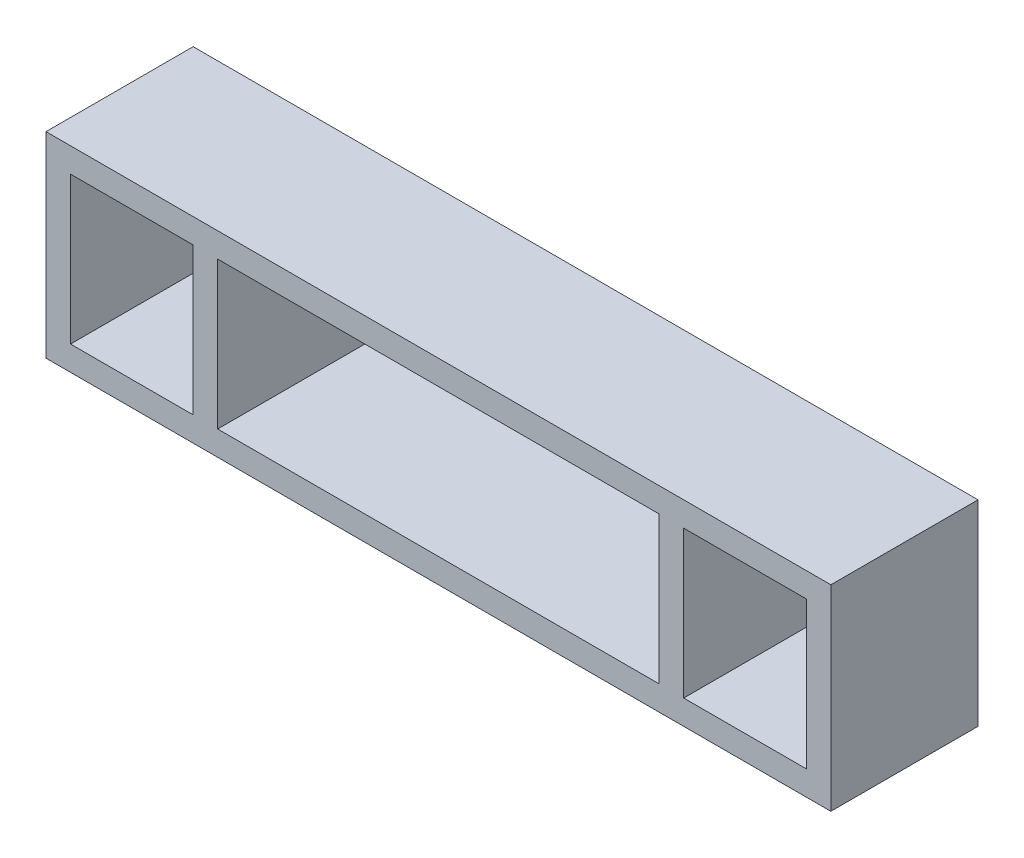
ISO-10303-21;
HEADER;
FILE_DESCRIPTION(('STEP AP214'),'2;1');
FILE_NAME('part.step','',(''),(''),'','','');
FILE_SCHEMA(('AUTOMOTIVE_DESIGN { 1 0 10303 214 1 1 1 1 }'));
ENDSEC;
DATA;
#1=APPLICATION_CONTEXT('core data for automotive mechanical design processes');
#2=APPLICATION_PROTOCOL_DEFINITION('international standard','automotive_design',2000,#1);
#3=PRODUCT_CONTEXT('',#1,'mechanical');
#4=PRODUCT('Part','Part','',(#3));
#5=PRODUCT_RELATED_PRODUCT_CATEGORY('part','',(#4));
#6=PRODUCT_DEFINITION_FORMATION('','',#4);
#7=PRODUCT_DEFINITION_CONTEXT('part definition',#1,'design');
#8=PRODUCT_DEFINITION('design','',#6,#7);
#9=PRODUCT_DEFINITION_SHAPE('','',#8);
#10=(LENGTH_UNIT() NAMED_UNIT(*) SI_UNIT(.MILLI.,.METRE.));
#11=(NAMED_UNIT(*) PLANE_ANGLE_UNIT() SI_UNIT($,.RADIAN.));
#12=(NAMED_UNIT(*) SI_UNIT($,.STERADIAN.) SOLID_ANGLE_UNIT());
#13=UNCERTAINTY_MEASURE_WITH_UNIT(LENGTH_MEASURE(1.E-05),#10,'distance_accuracy_value','');
#14=(GEOMETRIC_REPRESENTATION_CONTEXT(3) GLOBAL_UNCERTAINTY_ASSIGNED_CONTEXT((#13)) GLOBAL_UNIT_ASSIGNED_CONTEXT((#10,
#11,#12)) REPRESENTATION_CONTEXT('',''));
#15=CARTESIAN_POINT('',(0.,0.,0.));
#16=DIRECTION('',(0.,0.,1.));
#17=DIRECTION('',(1.,0.,0.));
#18=AXIS2_PLACEMENT_3D('',#15,#16,#17);
#19=CARTESIAN_POINT('',(0.,0.,30.));
#20=DIRECTION('',(0.,0.,1.));
#21=DIRECTION('',(1.,0.,0.));
#22=AXIS2_PLACEMENT_3D('',#19,#20,#21);
#23=PLANE('',#22);
#24=DIRECTION('',(0.,1.,0.));
#25=VECTOR('',#24,1.);
#26=CARTESIAN_POINT('',(80.,20.,30.));
#27=LINE('',#26,#25);
#28=CARTESIAN_POINT('',(80.,-20.,30.));
#29=VERTEX_POINT('',#28);
#30=CARTESIAN_POINT('',(80.,20.,30.));
#31=VERTEX_POINT('',#30);
#32=EDGE_CURVE('E293',#29,#31,#27,.T.);
#33=ORIENTED_EDGE('',*,*,#32,.T.);
#34=DIRECTION('',(-1.,0.,0.));
#35=VECTOR('',#34,1.);
#36=CARTESIAN_POINT('',(-80.,20.,30.));
#37=LINE('',#36,#35);
#38=CARTESIAN_POINT('',(-80.,20.,30.));
#39=VERTEX_POINT('',#38);
#40=EDGE_CURVE('E297',#31,#39,#37,.T.);
#41=ORIENTED_EDGE('',*,*,#40,.T.);
#42=DIRECTION('',(0.,-1.,0.));
#43=VECTOR('',#42,1.);
#44=CARTESIAN_POINT('',(-80.,20.,30.));
#45=LINE('',#44,#43);
#46=CARTESIAN_POINT('',(-80.,-20.,30.));
#47=VERTEX_POINT('',#46);
#48=EDGE_CURVE('E301',#39,#47,#45,.T.);
#49=ORIENTED_EDGE('',*,*,#48,.T.);
#50=DIRECTION('',(1.,0.,0.));
#51=VECTOR('',#50,1.);
#52=CARTESIAN_POINT('',(-80.,-20.,30.));
#53=LINE('',#52,#51);
#54=EDGE_CURVE('E304',#47,#29,#53,.T.);
#55=ORIENTED_EDGE('',*,*,#54,.T.);
#56=EDGE_LOOP('',(#33,#41,#49,#55));
#57=FACE_BOUND('',#56,.T.);
#58=DIRECTION('',(0.,-1.,0.));
#59=VECTOR('',#58,1.);
#60=CARTESIAN_POINT('',(50.,15.,30.));
#61=LINE('',#60,#59);
#62=CARTESIAN_POINT('',(50.,15.,30.));
#63=VERTEX_POINT('',#62);
#64=CARTESIAN_POINT('',(50.,-15.,30.));
#65=VERTEX_POINT('',#64);
#66=EDGE_CURVE('E253',#63,#65,#61,.T.);
#67=ORIENTED_EDGE('',*,*,#66,.F.);
#68=DIRECTION('',(-1.,0.,0.));
#69=VECTOR('',#68,1.);
#70=CARTESIAN_POINT('',(50.,15.,30.));
#71=LINE('',#70,#69);
#72=CARTESIAN_POINT('',(75.,15.,30.));
#73=VERTEX_POINT('',#72);
#74=EDGE_CURVE('E250',#73,#63,#71,.T.);
#75=ORIENTED_EDGE('',*,*,#74,.F.);
#76=DIRECTION('',(0.,1.,0.));
#77=VECTOR('',#76,1.);
#78=CARTESIAN_POINT('',(75.,-15.,30.));
#79=LINE('',#78,#77);
#80=CARTESIAN_POINT('',(75.,-15.,30.));
#81=VERTEX_POINT('',#80);
#82=EDGE_CURVE('E261',#81,#73,#79,.T.);
#83=ORIENTED_EDGE('',*,*,#82,.F.);
#84=DIRECTION('',(1.,0.,0.));
#85=VECTOR('',#84,1.);
#86=CARTESIAN_POINT('',(50.,-15.,30.));
#87=LINE('',#86,#85);
#88=EDGE_CURVE('E257',#65,#81,#87,.T.);
#89=ORIENTED_EDGE('',*,*,#88,.F.);
#90=EDGE_LOOP('',(#67,#75,#83,#89));
#91=FACE_BOUND('',#90,.T.);
#92=DIRECTION('',(1.,0.,0.));
#93=VECTOR('',#92,1.);
#94=CARTESIAN_POINT('',(-75.,-15.,30.));
#95=LINE('',#94,#93);
#96=CARTESIAN_POINT('',(-75.,-15.,30.));
#97=VERTEX_POINT('',#96);
#98=CARTESIAN_POINT('',(-50.,-15.,30.));
#99=VERTEX_POINT('',#98);
#100=EDGE_CURVE('E210',#97,#99,#95,.T.);
#101=ORIENTED_EDGE('',*,*,#100,.F.);
#102=DIRECTION('',(0.,-1.,0.));
#103=VECTOR('',#102,1.);
#104=CARTESIAN_POINT('',(-75.,-15.,30.));
#105=LINE('',#104,#103);
#106=CARTESIAN_POINT('',(-75.,15.,30.));
#107=VERTEX_POINT('',#106);
#108=EDGE_CURVE('E207',#107,#97,#105,.T.);
#109=ORIENTED_EDGE('',*,*,#108,.F.);
#110=DIRECTION('',(-1.,0.,0.));
#111=VECTOR('',#110,1.);
#112=CARTESIAN_POINT('',(-75.,15.,30.));
#113=LINE('',#112,#111);
#114=CARTESIAN_POINT('',(-50.,15.,30.));
#115=VERTEX_POINT('',#114);
#116=EDGE_CURVE('E218',#115,#107,#113,.T.);
#117=ORIENTED_EDGE('',*,*,#116,.F.);
#118=DIRECTION('',(0.,1.,0.));
#119=VECTOR('',#118,1.);
#120=CARTESIAN_POINT('',(-50.,15.,30.));
#121=LINE('',#120,#119);
#122=EDGE_CURVE('E214',#99,#115,#121,.T.);
#123=ORIENTED_EDGE('',*,*,#122,.F.);
#124=EDGE_LOOP('',(#101,#109,#117,#123));
#125=FACE_BOUND('',#124,.T.);
#126=DIRECTION('',(0.,1.,0.));
#127=VECTOR('',#126,1.);
#128=CARTESIAN_POINT('',(45.,15.,30.));
#129=LINE('',#128,#127);
#130=CARTESIAN_POINT('',(45.,-15.,30.));
#131=VERTEX_POINT('',#130);
#132=CARTESIAN_POINT('',(45.,15.,30.));
#133=VERTEX_POINT('',#132);
#134=EDGE_CURVE('E168',#131,#133,#129,.T.);
#135=ORIENTED_EDGE('',*,*,#134,.F.);
#136=DIRECTION('',(1.,0.,0.));
#137=VECTOR('',#136,1.);
#138=CARTESIAN_POINT('',(-45.,-15.,30.));
#139=LINE('',#138,#137);
#140=CARTESIAN_POINT('',(-45.,-15.,30.));
#141=VERTEX_POINT('',#140);
#142=EDGE_CURVE('E159',#141,#131,#139,.T.);
#143=ORIENTED_EDGE('',*,*,#142,.F.);
#144=DIRECTION('',(0.,-1.,0.));
#145=VECTOR('',#144,1.);
#146=CARTESIAN_POINT('',(-45.,15.,30.));
#147=LINE('',#146,#145);
#148=CARTESIAN_POINT('',(-45.,15.,30.));
#149=VERTEX_POINT('',#148);
#150=EDGE_CURVE('E185',#149,#141,#147,.T.);
#151=ORIENTED_EDGE('',*,*,#150,.F.);
#152=DIRECTION('',(-1.,0.,0.));
#153=VECTOR('',#152,1.);
#154=CARTESIAN_POINT('',(-45.,15.,30.));
#155=LINE('',#154,#153);
#156=EDGE_CURVE('E181',#133,#149,#155,.T.);
#157=ORIENTED_EDGE('',*,*,#156,.F.);
#158=EDGE_LOOP('',(#135,#143,#151,#157));
#159=FACE_BOUND('',#158,.T.);
#160=ADVANCED_FACE('F45',(#57,#91,#125,#159),#23,.T.);
#161=CARTESIAN_POINT('',(0.,0.,0.));
#162=DIRECTION('',(0.,0.,1.));
#163=DIRECTION('',(1.,0.,0.));
#164=AXIS2_PLACEMENT_3D('',#161,#162,#163);
#165=PLANE('',#164);
#166=DIRECTION('',(0.,-1.,0.));
#167=VECTOR('',#166,1.);
#168=CARTESIAN_POINT('',(-75.,-15.,0.));
#169=LINE('',#168,#167);
#170=CARTESIAN_POINT('',(-75.,15.,0.));
#171=VERTEX_POINT('',#170);
#172=CARTESIAN_POINT('',(-75.,-15.,0.));
#173=VERTEX_POINT('',#172);
#174=EDGE_CURVE('E177',#171,#173,#169,.T.);
#175=ORIENTED_EDGE('',*,*,#174,.T.);
#176=DIRECTION('',(1.,0.,0.));
#177=VECTOR('',#176,1.);
#178=CARTESIAN_POINT('',(-75.,-15.,0.));
#179=LINE('',#178,#177);
#180=CARTESIAN_POINT('',(-50.,-15.,0.));
#181=VERTEX_POINT('',#180);
#182=EDGE_CURVE('E225',#173,#181,#179,.T.);
#183=ORIENTED_EDGE('',*,*,#182,.T.);
#184=DIRECTION('',(0.,1.,0.));
#185=VECTOR('',#184,1.);
#186=CARTESIAN_POINT('',(-50.,15.,0.));
#187=LINE('',#186,#185);
#188=CARTESIAN_POINT('',(-50.,15.,0.));
#189=VERTEX_POINT('',#188);
#190=EDGE_CURVE('E229',#181,#189,#187,.T.);
#191=ORIENTED_EDGE('',*,*,#190,.T.);
#192=DIRECTION('',(-1.,0.,0.));
#193=VECTOR('',#192,1.);
#194=CARTESIAN_POINT('',(-75.,15.,0.));
#195=LINE('',#194,#193);
#196=EDGE_CURVE('E211',#189,#171,#195,.T.);
#197=ORIENTED_EDGE('',*,*,#196,.T.);
#198=EDGE_LOOP('',(#175,#183,#191,#197));
#199=FACE_BOUND('',#198,.T.);
#200=DIRECTION('',(0.,1.,0.));
#201=VECTOR('',#200,1.);
#202=CARTESIAN_POINT('',(80.,20.,0.));
#203=LINE('',#202,#201);
#204=CARTESIAN_POINT('',(80.,-20.,0.));
#205=VERTEX_POINT('',#204);
#206=CARTESIAN_POINT('',(80.,20.,0.));
#207=VERTEX_POINT('',#206);
#208=EDGE_CURVE('E292',#205,#207,#203,.T.);
#209=ORIENTED_EDGE('',*,*,#208,.F.);
#210=DIRECTION('',(1.,0.,0.));
#211=VECTOR('',#210,1.);
#212=CARTESIAN_POINT('',(-80.,-20.,0.));
#213=LINE('',#212,#211);
#214=CARTESIAN_POINT('',(-80.,-20.,0.));
#215=VERTEX_POINT('',#214);
#216=EDGE_CURVE('E298',#215,#205,#213,.T.);
#217=ORIENTED_EDGE('',*,*,#216,.F.);
#218=DIRECTION('',(0.,-1.,0.));
#219=VECTOR('',#218,1.);
#220=CARTESIAN_POINT('',(-80.,20.,0.));
#221=LINE('',#220,#219);
#222=CARTESIAN_POINT('',(-80.,20.,0.));
#223=VERTEX_POINT('',#222);
#224=EDGE_CURVE('E314',#223,#215,#221,.T.);
#225=ORIENTED_EDGE('',*,*,#224,.F.);
#226=DIRECTION('',(-1.,0.,0.));
#227=VECTOR('',#226,1.);
#228=CARTESIAN_POINT('',(-80.,20.,0.));
#229=LINE('',#228,#227);
#230=EDGE_CURVE('E311',#207,#223,#229,.T.);
#231=ORIENTED_EDGE('',*,*,#230,.F.);
#232=EDGE_LOOP('',(#209,#217,#225,#231));
#233=FACE_BOUND('',#232,.T.);
#234=DIRECTION('',(-1.,0.,0.));
#235=VECTOR('',#234,1.);
#236=CARTESIAN_POINT('',(50.,15.,0.));
#237=LINE('',#236,#235);
#238=CARTESIAN_POINT('',(75.,15.,0.));
#239=VERTEX_POINT('',#238);
#240=CARTESIAN_POINT('',(50.,15.,0.));
#241=VERTEX_POINT('',#240);
#242=EDGE_CURVE('E249',#239,#241,#237,.T.);
#243=ORIENTED_EDGE('',*,*,#242,.T.);
#244=DIRECTION('',(0.,-1.,0.));
#245=VECTOR('',#244,1.);
#246=CARTESIAN_POINT('',(50.,15.,0.));
#247=LINE('',#246,#245);
#248=CARTESIAN_POINT('',(50.,-15.,0.));
#249=VERTEX_POINT('',#248);
#250=EDGE_CURVE('E268',#241,#249,#247,.T.);
#251=ORIENTED_EDGE('',*,*,#250,.T.);
#252=DIRECTION('',(1.,0.,0.));
#253=VECTOR('',#252,1.);
#254=CARTESIAN_POINT('',(50.,-15.,0.));
#255=LINE('',#254,#253);
#256=CARTESIAN_POINT('',(75.,-15.,0.));
#257=VERTEX_POINT('',#256);
#258=EDGE_CURVE('E272',#249,#257,#255,.T.);
#259=ORIENTED_EDGE('',*,*,#258,.T.);
#260=DIRECTION('',(0.,1.,0.));
#261=VECTOR('',#260,1.);
#262=CARTESIAN_POINT('',(75.,-15.,0.));
#263=LINE('',#262,#261);
#264=EDGE_CURVE('E254',#257,#239,#263,.T.);
#265=ORIENTED_EDGE('',*,*,#264,.T.);
#266=EDGE_LOOP('',(#243,#251,#259,#265));
#267=FACE_BOUND('',#266,.T.);
#268=DIRECTION('',(1.,0.,0.));
#269=VECTOR('',#268,1.);
#270=CARTESIAN_POINT('',(-45.,-15.,0.));
#271=LINE('',#270,#269);
#272=CARTESIAN_POINT('',(-45.,-15.,0.));
#273=VERTEX_POINT('',#272);
#274=CARTESIAN_POINT('',(45.,-15.,0.));
#275=VERTEX_POINT('',#274);
#276=EDGE_CURVE('E69',#273,#275,#271,.T.);
#277=ORIENTED_EDGE('',*,*,#276,.T.);
#278=DIRECTION('',(0.,1.,0.));
#279=VECTOR('',#278,1.);
#280=CARTESIAN_POINT('',(45.,15.,0.));
#281=LINE('',#280,#279);
#282=CARTESIAN_POINT('',(45.,15.,0.));
#283=VERTEX_POINT('',#282);
#284=EDGE_CURVE('E175',#275,#283,#281,.T.);
#285=ORIENTED_EDGE('',*,*,#284,.T.);
#286=DIRECTION('',(-1.,0.,0.));
#287=VECTOR('',#286,1.);
#288=CARTESIAN_POINT('',(-45.,15.,0.));
#289=LINE('',#288,#287);
#290=CARTESIAN_POINT('',(-45.,15.,0.));
#291=VERTEX_POINT('',#290);
#292=EDGE_CURVE('E194',#283,#291,#289,.T.);
#293=ORIENTED_EDGE('',*,*,#292,.T.);
#294=DIRECTION('',(0.,-1.,0.));
#295=VECTOR('',#294,1.);
#296=CARTESIAN_POINT('',(-45.,15.,0.));
#297=LINE('',#296,#295);
#298=EDGE_CURVE('E169',#291,#273,#297,.T.);
#299=ORIENTED_EDGE('',*,*,#298,.T.);
#300=EDGE_LOOP('',(#277,#285,#293,#299));
#301=FACE_BOUND('',#300,.T.);
#302=ADVANCED_FACE('F337',(#199,#233,#267,#301),#165,.F.);
#303=CARTESIAN_POINT('',(80.,20.,30.));
#304=DIRECTION('',(-1.,0.,0.));
#305=DIRECTION('',(0.,0.,1.));
#306=AXIS2_PLACEMENT_3D('',#303,#304,#305);
#307=PLANE('',#306);
#308=ORIENTED_EDGE('',*,*,#208,.T.);
#309=DIRECTION('',(0.,0.,-1.));
#310=VECTOR('',#309,1.);
#311=CARTESIAN_POINT('',(80.,20.,30.));
#312=LINE('',#311,#310);
#313=EDGE_CURVE('E11',#31,#207,#312,.T.);
#314=ORIENTED_EDGE('',*,*,#313,.F.);
#315=ORIENTED_EDGE('',*,*,#32,.F.);
#316=DIRECTION('',(0.,0.,-1.));
#317=VECTOR('',#316,1.);
#318=CARTESIAN_POINT('',(80.,-20.,30.));
#319=LINE('',#318,#317);
#320=EDGE_CURVE('E307',#29,#205,#319,.T.);
#321=ORIENTED_EDGE('',*,*,#320,.T.);
#322=EDGE_LOOP('',(#308,#314,#315,#321));
#323=FACE_BOUND('',#322,.T.);
#324=ADVANCED_FACE('F47',(#323),#307,.F.);
#325=CARTESIAN_POINT('',(-80.,20.,30.));
#326=DIRECTION('',(0.,-1.,0.));
#327=DIRECTION('',(0.,0.,-1.));
#328=AXIS2_PLACEMENT_3D('',#325,#326,#327);
#329=PLANE('',#328);
#330=ORIENTED_EDGE('',*,*,#230,.T.);
#331=DIRECTION('',(0.,0.,-1.));
#332=VECTOR('',#331,1.);
#333=CARTESIAN_POINT('',(-80.,20.,30.));
#334=LINE('',#333,#332);
#335=EDGE_CURVE('E54',#39,#223,#334,.T.);
#336=ORIENTED_EDGE('',*,*,#335,.F.);
#337=ORIENTED_EDGE('',*,*,#40,.F.);
#338=ORIENTED_EDGE('',*,*,#313,.T.);
#339=EDGE_LOOP('',(#330,#336,#337,#338));
#340=FACE_BOUND('',#339,.T.);
#341=ADVANCED_FACE('F348',(#340),#329,.F.);
#342=CARTESIAN_POINT('',(-80.,20.,30.));
#343=DIRECTION('',(1.,0.,0.));
#344=DIRECTION('',(0.,0.,-1.));
#345=AXIS2_PLACEMENT_3D('',#342,#343,#344);
#346=PLANE('',#345);
#347=ORIENTED_EDGE('',*,*,#224,.T.);
#348=DIRECTION('',(0.,0.,-1.));
#349=VECTOR('',#348,1.);
#350=CARTESIAN_POINT('',(-80.,-20.,30.));
#351=LINE('',#350,#349);
#352=EDGE_CURVE('E322',#47,#215,#351,.T.);
#353=ORIENTED_EDGE('',*,*,#352,.F.);
#354=ORIENTED_EDGE('',*,*,#48,.F.);
#355=ORIENTED_EDGE('',*,*,#335,.T.);
#356=EDGE_LOOP('',(#347,#353,#354,#355));
#357=FACE_BOUND('',#356,.T.);
#358=ADVANCED_FACE('F331',(#357),#346,.F.);
#359=CARTESIAN_POINT('',(-80.,-20.,30.));
#360=DIRECTION('',(0.,1.,0.));
#361=DIRECTION('',(0.,0.,1.));
#362=AXIS2_PLACEMENT_3D('',#359,#360,#361);
#363=PLANE('',#362);
#364=ORIENTED_EDGE('',*,*,#216,.T.);
#365=ORIENTED_EDGE('',*,*,#320,.F.);
#366=ORIENTED_EDGE('',*,*,#54,.F.);
#367=ORIENTED_EDGE('',*,*,#352,.T.);
#368=EDGE_LOOP('',(#364,#365,#366,#367));
#369=FACE_BOUND('',#368,.T.);
#370=ADVANCED_FACE('F341',(#369),#363,.F.);
#371=CARTESIAN_POINT('',(50.,15.,30.));
#372=DIRECTION('',(0.,-1.,0.));
#373=DIRECTION('',(0.,0.,-1.));
#374=AXIS2_PLACEMENT_3D('',#371,#372,#373);
#375=PLANE('',#374);
#376=ORIENTED_EDGE('',*,*,#242,.F.);
#377=DIRECTION('',(0.,0.,-1.));
#378=VECTOR('',#377,1.);
#379=CARTESIAN_POINT('',(75.,15.,30.));
#380=LINE('',#379,#378);
#381=EDGE_CURVE('E264',#73,#239,#380,.T.);
#382=ORIENTED_EDGE('',*,*,#381,.F.);
#383=ORIENTED_EDGE('',*,*,#74,.T.);
#384=DIRECTION('',(0.,0.,-1.));
#385=VECTOR('',#384,1.);
#386=CARTESIAN_POINT('',(50.,15.,30.));
#387=LINE('',#386,#385);
#388=EDGE_CURVE('E288',#63,#241,#387,.T.);
#389=ORIENTED_EDGE('',*,*,#388,.T.);
#390=EDGE_LOOP('',(#376,#382,#383,#389));
#391=FACE_BOUND('',#390,.T.);
#392=ADVANCED_FACE('F363',(#391),#375,.T.);
#393=CARTESIAN_POINT('',(50.,15.,30.));
#394=DIRECTION('',(1.,0.,0.));
#395=DIRECTION('',(0.,1.,0.));
#396=AXIS2_PLACEMENT_3D('',#393,#394,#395);
#397=PLANE('',#396);
#398=ORIENTED_EDGE('',*,*,#250,.F.);
#399=ORIENTED_EDGE('',*,*,#388,.F.);
#400=ORIENTED_EDGE('',*,*,#66,.T.);
#401=DIRECTION('',(0.,0.,-1.));
#402=VECTOR('',#401,1.);
#403=CARTESIAN_POINT('',(50.,-15.,30.));
#404=LINE('',#403,#402);
#405=EDGE_CURVE('E285',#65,#249,#404,.T.);
#406=ORIENTED_EDGE('',*,*,#405,.T.);
#407=EDGE_LOOP('',(#398,#399,#400,#406));
#408=FACE_BOUND('',#407,.T.);
#409=ADVANCED_FACE('F370',(#408),#397,.T.);
#410=CARTESIAN_POINT('',(50.,-15.,30.));
#411=DIRECTION('',(0.,1.,0.));
#412=DIRECTION('',(-1.,0.,0.));
#413=AXIS2_PLACEMENT_3D('',#410,#411,#412);
#414=PLANE('',#413);
#415=ORIENTED_EDGE('',*,*,#258,.F.);
#416=ORIENTED_EDGE('',*,*,#405,.F.);
#417=ORIENTED_EDGE('',*,*,#88,.T.);
#418=DIRECTION('',(0.,0.,-1.));
#419=VECTOR('',#418,1.);
#420=CARTESIAN_POINT('',(75.,-15.,30.));
#421=LINE('',#420,#419);
#422=EDGE_CURVE('E282',#81,#257,#421,.T.);
#423=ORIENTED_EDGE('',*,*,#422,.T.);
#424=EDGE_LOOP('',(#415,#416,#417,#423));
#425=FACE_BOUND('',#424,.T.);
#426=ADVANCED_FACE('F375',(#425),#414,.T.);
#427=CARTESIAN_POINT('',(75.,-15.,30.));
#428=DIRECTION('',(-1.,0.,0.));
#429=DIRECTION('',(0.,0.,1.));
#430=AXIS2_PLACEMENT_3D('',#427,#428,#429);
#431=PLANE('',#430);
#432=ORIENTED_EDGE('',*,*,#264,.F.);
#433=ORIENTED_EDGE('',*,*,#422,.F.);
#434=ORIENTED_EDGE('',*,*,#82,.T.);
#435=ORIENTED_EDGE('',*,*,#381,.T.);
#436=EDGE_LOOP('',(#432,#433,#434,#435));
#437=FACE_BOUND('',#436,.T.);
#438=ADVANCED_FACE('F382',(#437),#431,.T.);
#439=CARTESIAN_POINT('',(-75.,-15.,30.));
#440=DIRECTION('',(1.,0.,0.));
#441=DIRECTION('',(0.,0.,-1.));
#442=AXIS2_PLACEMENT_3D('',#439,#440,#441);
#443=PLANE('',#442);
#444=ORIENTED_EDGE('',*,*,#174,.F.);
#445=DIRECTION('',(0.,0.,-1.));
#446=VECTOR('',#445,1.);
#447=CARTESIAN_POINT('',(-75.,15.,30.));
#448=LINE('',#447,#446);
#449=EDGE_CURVE('E221',#107,#171,#448,.T.);
#450=ORIENTED_EDGE('',*,*,#449,.F.);
#451=ORIENTED_EDGE('',*,*,#108,.T.);
#452=DIRECTION('',(0.,0.,-1.));
#453=VECTOR('',#452,1.);
#454=CARTESIAN_POINT('',(-75.,-15.,30.));
#455=LINE('',#454,#453);
#456=EDGE_CURVE('E245',#97,#173,#455,.T.);
#457=ORIENTED_EDGE('',*,*,#456,.T.);
#458=EDGE_LOOP('',(#444,#450,#451,#457));
#459=FACE_BOUND('',#458,.T.);
#460=ADVANCED_FACE('F404',(#459),#443,.T.);
#461=CARTESIAN_POINT('',(-75.,-15.,30.));
#462=DIRECTION('',(0.,1.,0.));
#463=DIRECTION('',(-1.,0.,0.));
#464=AXIS2_PLACEMENT_3D('',#461,#462,#463);
#465=PLANE('',#464);
#466=ORIENTED_EDGE('',*,*,#182,.F.);
#467=ORIENTED_EDGE('',*,*,#456,.F.);
#468=ORIENTED_EDGE('',*,*,#100,.T.);
#469=DIRECTION('',(0.,0.,-1.));
#470=VECTOR('',#469,1.);
#471=CARTESIAN_POINT('',(-50.,-15.,30.));
#472=LINE('',#471,#470);
#473=EDGE_CURVE('E242',#99,#181,#472,.T.);
#474=ORIENTED_EDGE('',*,*,#473,.T.);
#475=EDGE_LOOP('',(#466,#467,#468,#474));
#476=FACE_BOUND('',#475,.T.);
#477=ADVANCED_FACE('F398',(#476),#465,.T.);
#478=CARTESIAN_POINT('',(-50.,15.,30.));
#479=DIRECTION('',(-1.,0.,0.));
#480=DIRECTION('',(0.,-1.,0.));
#481=AXIS2_PLACEMENT_3D('',#478,#479,#480);
#482=PLANE('',#481);
#483=ORIENTED_EDGE('',*,*,#190,.F.);
#484=ORIENTED_EDGE('',*,*,#473,.F.);
#485=ORIENTED_EDGE('',*,*,#122,.T.);
#486=DIRECTION('',(0.,0.,-1.));
#487=VECTOR('',#486,1.);
#488=CARTESIAN_POINT('',(-50.,15.,30.));
#489=LINE('',#488,#487);
#490=EDGE_CURVE('E239',#115,#189,#489,.T.);
#491=ORIENTED_EDGE('',*,*,#490,.T.);
#492=EDGE_LOOP('',(#483,#484,#485,#491));
#493=FACE_BOUND('',#492,.T.);
#494=ADVANCED_FACE('F401',(#493),#482,.T.);
#495=CARTESIAN_POINT('',(-75.,15.,30.));
#496=DIRECTION('',(0.,-1.,0.));
#497=DIRECTION('',(0.,0.,-1.));
#498=AXIS2_PLACEMENT_3D('',#495,#496,#497);
#499=PLANE('',#498);
#500=ORIENTED_EDGE('',*,*,#196,.F.);
#501=ORIENTED_EDGE('',*,*,#490,.F.);
#502=ORIENTED_EDGE('',*,*,#116,.T.);
#503=ORIENTED_EDGE('',*,*,#449,.T.);
#504=EDGE_LOOP('',(#500,#501,#502,#503));
#505=FACE_BOUND('',#504,.T.);
#506=ADVANCED_FACE('F407',(#505),#499,.T.);
#507=CARTESIAN_POINT('',(-45.,-15.,30.));
#508=DIRECTION('',(0.,1.,0.));
#509=DIRECTION('',(0.,0.,1.));
#510=AXIS2_PLACEMENT_3D('',#507,#508,#509);
#511=PLANE('',#510);
#512=ORIENTED_EDGE('',*,*,#276,.F.);
#513=DIRECTION('',(0.,0.,-1.));
#514=VECTOR('',#513,1.);
#515=CARTESIAN_POINT('',(-45.,-15.,30.));
#516=LINE('',#515,#514);
#517=EDGE_CURVE('E163',#141,#273,#516,.T.);
#518=ORIENTED_EDGE('',*,*,#517,.F.);
#519=ORIENTED_EDGE('',*,*,#142,.T.);
#520=DIRECTION('',(0.,0.,-1.));
#521=VECTOR('',#520,1.);
#522=CARTESIAN_POINT('',(45.,-15.,30.));
#523=LINE('',#522,#521);
#524=EDGE_CURVE('E162',#131,#275,#523,.T.);
#525=ORIENTED_EDGE('',*,*,#524,.T.);
#526=EDGE_LOOP('',(#512,#518,#519,#525));
#527=FACE_BOUND('',#526,.T.);
#528=ADVANCED_FACE('F161',(#527),#511,.T.);
#529=CARTESIAN_POINT('',(45.,15.,30.));
#530=DIRECTION('',(-1.,0.,0.));
#531=DIRECTION('',(0.,-1.,0.));
#532=AXIS2_PLACEMENT_3D('',#529,#530,#531);
#533=PLANE('',#532);
#534=ORIENTED_EDGE('',*,*,#284,.F.);
#535=ORIENTED_EDGE('',*,*,#524,.F.);
#536=ORIENTED_EDGE('',*,*,#134,.T.);
#537=DIRECTION('',(0.,0.,-1.));
#538=VECTOR('',#537,1.);
#539=CARTESIAN_POINT('',(45.,15.,30.));
#540=LINE('',#539,#538);
#541=EDGE_CURVE('E178',#133,#283,#540,.T.);
#542=ORIENTED_EDGE('',*,*,#541,.T.);
#543=EDGE_LOOP('',(#534,#535,#536,#542));
#544=FACE_BOUND('',#543,.T.);
#545=ADVANCED_FACE('F172',(#544),#533,.T.);
#546=CARTESIAN_POINT('',(-45.,15.,30.));
#547=DIRECTION('',(0.,-1.,0.));
#548=DIRECTION('',(0.,0.,-1.));
#549=AXIS2_PLACEMENT_3D('',#546,#547,#548);
#550=PLANE('',#549);
#551=ORIENTED_EDGE('',*,*,#292,.F.);
#552=ORIENTED_EDGE('',*,*,#541,.F.);
#553=ORIENTED_EDGE('',*,*,#156,.T.);
#554=DIRECTION('',(0.,0.,-1.));
#555=VECTOR('',#554,1.);
#556=CARTESIAN_POINT('',(-45.,15.,30.));
#557=LINE('',#556,#555);
#558=EDGE_CURVE('E61',#149,#291,#557,.T.);
#559=ORIENTED_EDGE('',*,*,#558,.T.);
#560=EDGE_LOOP('',(#551,#552,#553,#559));
#561=FACE_BOUND('',#560,.T.);
#562=ADVANCED_FACE('F469',(#561),#550,.T.);
#563=CARTESIAN_POINT('',(-45.,15.,30.));
#564=DIRECTION('',(1.,0.,0.));
#565=DIRECTION('',(0.,1.,0.));
#566=AXIS2_PLACEMENT_3D('',#563,#564,#565);
#567=PLANE('',#566);
#568=ORIENTED_EDGE('',*,*,#298,.F.);
#569=ORIENTED_EDGE('',*,*,#558,.F.);
#570=ORIENTED_EDGE('',*,*,#150,.T.);
#571=ORIENTED_EDGE('',*,*,#517,.T.);
#572=EDGE_LOOP('',(#568,#569,#570,#571));
#573=FACE_BOUND('',#572,.T.);
#574=ADVANCED_FACE('F477',(#573),#567,.T.);
#575=CLOSED_SHELL('',(#160,#302,#324,#341,#358,#370,#392,#409,#426,#438,#460,#477,#494,#506,
#528,#545,#562,#574));
#576=MANIFOLD_SOLID_BREP('B2',#575);
#577=ADVANCED_BREP_SHAPE_REPRESENTATION('',(#18,#576),#14);
#578=SHAPE_DEFINITION_REPRESENTATION(#9,#577);
ENDSEC;
END-ISO-10303-21;
